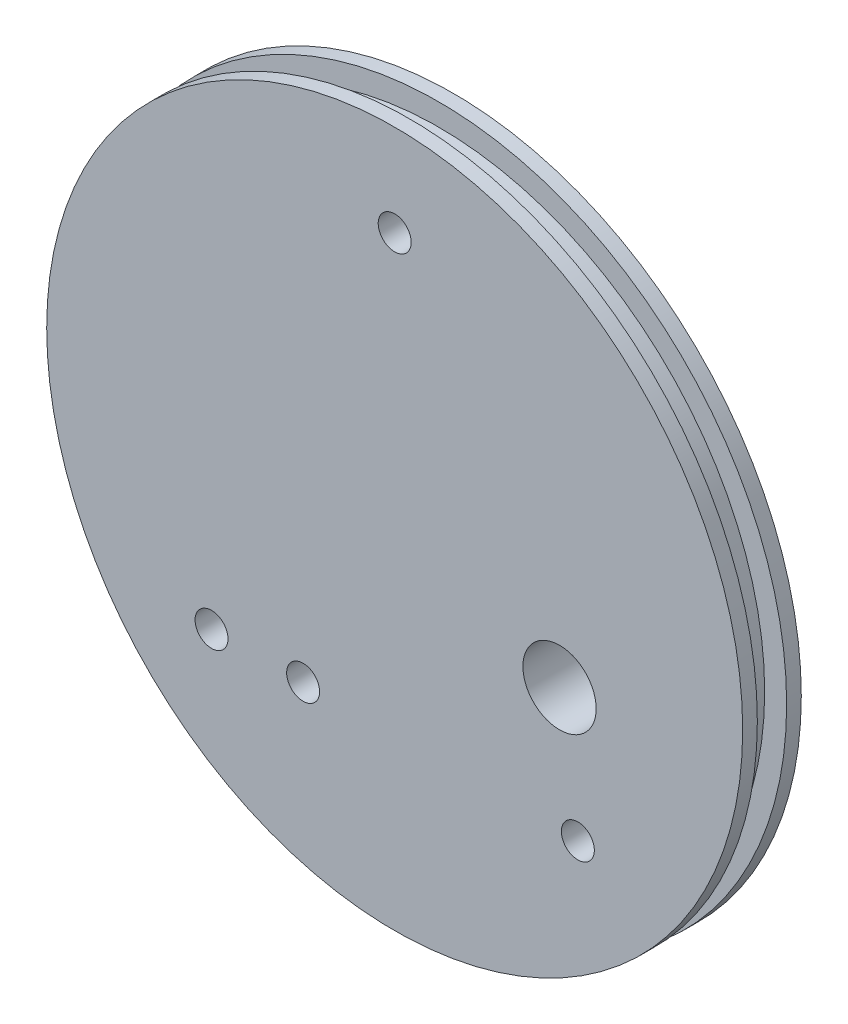
ISO-10303-21;
HEADER;
FILE_DESCRIPTION(('STEP AP214'),'2;1');
FILE_NAME('part.step','',(''),(''),'','','');
FILE_SCHEMA(('AUTOMOTIVE_DESIGN { 1 0 10303 214 1 1 1 1 }'));
ENDSEC;
DATA;
#1=APPLICATION_CONTEXT('core data for automotive mechanical design processes');
#2=APPLICATION_PROTOCOL_DEFINITION('international standard','automotive_design',2000,#1);
#3=PRODUCT_CONTEXT('',#1,'mechanical');
#4=PRODUCT('Part','Part','',(#3));
#5=PRODUCT_RELATED_PRODUCT_CATEGORY('part','',(#4));
#6=PRODUCT_DEFINITION_FORMATION('','',#4);
#7=PRODUCT_DEFINITION_CONTEXT('part definition',#1,'design');
#8=PRODUCT_DEFINITION('design','',#6,#7);
#9=PRODUCT_DEFINITION_SHAPE('','',#8);
#10=(LENGTH_UNIT() NAMED_UNIT(*) SI_UNIT(.MILLI.,.METRE.));
#11=(NAMED_UNIT(*) PLANE_ANGLE_UNIT() SI_UNIT($,.RADIAN.));
#12=(NAMED_UNIT(*) SI_UNIT($,.STERADIAN.) SOLID_ANGLE_UNIT());
#13=UNCERTAINTY_MEASURE_WITH_UNIT(LENGTH_MEASURE(1.E-05),#10,'distance_accuracy_value','');
#14=(GEOMETRIC_REPRESENTATION_CONTEXT(3) GLOBAL_UNCERTAINTY_ASSIGNED_CONTEXT((#13)) GLOBAL_UNIT_ASSIGNED_CONTEXT((#10,
#11,#12)) REPRESENTATION_CONTEXT('',''));
#15=CARTESIAN_POINT('',(0.,0.,0.));
#16=DIRECTION('',(0.,0.,1.));
#17=DIRECTION('',(1.,0.,0.));
#18=AXIS2_PLACEMENT_3D('',#15,#16,#17);
#19=CARTESIAN_POINT('',(0.,0.,8.));
#20=DIRECTION('',(0.,0.,1.));
#21=DIRECTION('',(1.,0.,0.));
#22=AXIS2_PLACEMENT_3D('',#19,#20,#21);
#23=PLANE('',#22);
#24=CARTESIAN_POINT('',(45.,-15.,8.));
#25=DIRECTION('',(0.,0.,1.));
#26=DIRECTION('',(1.,0.,0.));
#27=AXIS2_PLACEMENT_3D('',#24,#25,#26);
#28=CIRCLE('',#27,10.);
#29=CARTESIAN_POINT('',(55.,-15.,8.));
#30=VERTEX_POINT('',#29);
#31=EDGE_CURVE('E175',#30,#30,#28,.T.);
#32=ORIENTED_EDGE('',*,*,#31,.F.);
#33=EDGE_LOOP('',(#32));
#34=FACE_BOUND('',#33,.T.);
#35=CARTESIAN_POINT('',(0.,70.,8.00000000000001));
#36=DIRECTION('',(0.,0.,1.));
#37=DIRECTION('',(1.,0.,0.));
#38=AXIS2_PLACEMENT_3D('',#35,#36,#37);
#39=CIRCLE('',#38,4.5);
#40=CARTESIAN_POINT('',(4.5,70.,8.00000000000001));
#41=VERTEX_POINT('',#40);
#42=EDGE_CURVE('E181',#41,#41,#39,.F.);
#43=ORIENTED_EDGE('',*,*,#42,.T.);
#44=EDGE_LOOP('',(#43));
#45=FACE_BOUND('',#44,.T.);
#46=CARTESIAN_POINT('',(-50.,-48.75,8.));
#47=DIRECTION('',(0.,0.,1.));
#48=DIRECTION('',(1.,0.,0.));
#49=AXIS2_PLACEMENT_3D('',#46,#47,#48);
#50=CIRCLE('',#49,4.5);
#51=CARTESIAN_POINT('',(-45.5,-48.75,8.00000000000001));
#52=VERTEX_POINT('',#51);
#53=EDGE_CURVE('E75',#52,#52,#50,.T.);
#54=ORIENTED_EDGE('',*,*,#53,.F.);
#55=EDGE_LOOP('',(#54));
#56=FACE_BOUND('',#55,.T.);
#57=CARTESIAN_POINT('',(50.,-48.75,8.));
#58=DIRECTION('',(0.,0.,1.));
#59=DIRECTION('',(1.,0.,0.));
#60=AXIS2_PLACEMENT_3D('',#57,#58,#59);
#61=CIRCLE('',#60,4.5);
#62=CARTESIAN_POINT('',(54.5,-48.75,8.00000000000001));
#63=VERTEX_POINT('',#62);
#64=EDGE_CURVE('E187',#63,#63,#61,.T.);
#65=ORIENTED_EDGE('',*,*,#64,.F.);
#66=EDGE_LOOP('',(#65));
#67=FACE_BOUND('',#66,.T.);
#68=CARTESIAN_POINT('',(-25.,-48.75,8.));
#69=DIRECTION('',(0.,0.,1.));
#70=DIRECTION('',(1.,0.,0.));
#71=AXIS2_PLACEMENT_3D('',#68,#69,#70);
#72=CIRCLE('',#71,4.50000000000001);
#73=CARTESIAN_POINT('',(-20.5,-48.75,8.00000000000001));
#74=VERTEX_POINT('',#73);
#75=EDGE_CURVE('E95',#74,#74,#72,.T.);
#76=ORIENTED_EDGE('',*,*,#75,.F.);
#77=EDGE_LOOP('',(#76));
#78=FACE_BOUND('',#77,.T.);
#79=CARTESIAN_POINT('',(0.,0.,8.));
#80=DIRECTION('',(0.,0.,1.));
#81=DIRECTION('',(1.,0.,0.));
#82=AXIS2_PLACEMENT_3D('',#79,#80,#81);
#83=CIRCLE('',#82,95.);
#84=CARTESIAN_POINT('',(95.,0.,8.));
#85=VERTEX_POINT('',#84);
#86=EDGE_CURVE('E60',#85,#85,#83,.T.);
#87=ORIENTED_EDGE('',*,*,#86,.T.);
#88=EDGE_LOOP('',(#87));
#89=FACE_BOUND('',#88,.T.);
#90=ADVANCED_FACE('F51',(#34,#45,#56,#67,#78,#89),#23,.T.);
#91=CARTESIAN_POINT('',(0.,0.,-8.));
#92=DIRECTION('',(0.,0.,1.));
#93=DIRECTION('',(1.,0.,0.));
#94=AXIS2_PLACEMENT_3D('',#91,#92,#93);
#95=CYLINDRICAL_SURFACE('',#94,95.);
#96=CARTESIAN_POINT('',(0.,0.,4.));
#97=DIRECTION('',(0.,0.,1.));
#98=DIRECTION('',(1.,0.,0.));
#99=AXIS2_PLACEMENT_3D('',#96,#97,#98);
#100=CIRCLE('',#99,95.);
#101=CARTESIAN_POINT('',(95.,0.,4.));
#102=VERTEX_POINT('',#101);
#103=EDGE_CURVE('E66',#102,#102,#100,.T.);
#104=ORIENTED_EDGE('',*,*,#103,.T.);
#105=EDGE_LOOP('',(#104));
#106=FACE_BOUND('',#105,.T.);
#107=ORIENTED_EDGE('',*,*,#86,.F.);
#108=EDGE_LOOP('',(#107));
#109=FACE_BOUND('',#108,.T.);
#110=ADVANCED_FACE('F53',(#106,#109),#95,.T.);
#111=CARTESIAN_POINT('',(0.,0.,4.));
#112=DIRECTION('',(0.,0.,1.));
#113=DIRECTION('',(1.,0.,0.));
#114=AXIS2_PLACEMENT_3D('',#111,#112,#113);
#115=PLANE('',#114);
#116=ORIENTED_EDGE('',*,*,#103,.F.);
#117=EDGE_LOOP('',(#116));
#118=FACE_BOUND('',#117,.T.);
#119=CARTESIAN_POINT('',(0.,0.,4.));
#120=DIRECTION('',(0.,0.,1.));
#121=DIRECTION('',(1.,0.,0.));
#122=AXIS2_PLACEMENT_3D('',#119,#120,#121);
#123=CIRCLE('',#122,89.);
#124=CARTESIAN_POINT('',(89.,0.,4.));
#125=VERTEX_POINT('',#124);
#126=EDGE_CURVE('E92',#125,#125,#123,.T.);
#127=ORIENTED_EDGE('',*,*,#126,.T.);
#128=EDGE_LOOP('',(#127));
#129=FACE_BOUND('',#128,.T.);
#130=ADVANCED_FACE('F106',(#118,#129),#115,.F.);
#131=CARTESIAN_POINT('',(0.,0.,4.));
#132=DIRECTION('',(0.,0.,-1.));
#133=DIRECTION('',(-1.,0.,0.));
#134=AXIS2_PLACEMENT_3D('',#131,#132,#133);
#135=CYLINDRICAL_SURFACE('',#134,89.);
#136=ORIENTED_EDGE('',*,*,#126,.F.);
#137=EDGE_LOOP('',(#136));
#138=FACE_BOUND('',#137,.T.);
#139=CARTESIAN_POINT('',(0.,0.,-4.));
#140=DIRECTION('',(0.,0.,1.));
#141=DIRECTION('',(1.,0.,0.));
#142=AXIS2_PLACEMENT_3D('',#139,#140,#141);
#143=CIRCLE('',#142,89.);
#144=CARTESIAN_POINT('',(89.,0.,-4.));
#145=VERTEX_POINT('',#144);
#146=EDGE_CURVE('E81',#145,#145,#143,.T.);
#147=ORIENTED_EDGE('',*,*,#146,.T.);
#148=EDGE_LOOP('',(#147));
#149=FACE_BOUND('',#148,.T.);
#150=ADVANCED_FACE('F109',(#138,#149),#135,.T.);
#151=CARTESIAN_POINT('',(0.,0.,-4.));
#152=DIRECTION('',(0.,0.,1.));
#153=DIRECTION('',(1.,0.,0.));
#154=AXIS2_PLACEMENT_3D('',#151,#152,#153);
#155=PLANE('',#154);
#156=ORIENTED_EDGE('',*,*,#146,.F.);
#157=EDGE_LOOP('',(#156));
#158=FACE_BOUND('',#157,.T.);
#159=CARTESIAN_POINT('',(0.,0.,-4.));
#160=DIRECTION('',(0.,0.,1.));
#161=DIRECTION('',(1.,0.,0.));
#162=AXIS2_PLACEMENT_3D('',#159,#160,#161);
#163=CIRCLE('',#162,95.);
#164=CARTESIAN_POINT('',(95.,0.,-4.));
#165=VERTEX_POINT('',#164);
#166=EDGE_CURVE('E86',#165,#165,#163,.T.);
#167=ORIENTED_EDGE('',*,*,#166,.T.);
#168=EDGE_LOOP('',(#167));
#169=FACE_BOUND('',#168,.T.);
#170=ADVANCED_FACE('F114',(#158,#169),#155,.T.);
#171=CARTESIAN_POINT('',(0.,0.,-8.));
#172=DIRECTION('',(0.,0.,1.));
#173=DIRECTION('',(1.,0.,0.));
#174=AXIS2_PLACEMENT_3D('',#171,#172,#173);
#175=PLANE('',#174);
#176=CARTESIAN_POINT('',(45.,-15.,-8.));
#177=DIRECTION('',(0.,0.,-1.));
#178=DIRECTION('',(-1.,0.,0.));
#179=AXIS2_PLACEMENT_3D('',#176,#177,#178);
#180=CIRCLE('',#179,10.);
#181=CARTESIAN_POINT('',(35.,-15.,-8.));
#182=VERTEX_POINT('',#181);
#183=EDGE_CURVE('E140',#182,#182,#180,.T.);
#184=ORIENTED_EDGE('',*,*,#183,.F.);
#185=EDGE_LOOP('',(#184));
#186=FACE_BOUND('',#185,.T.);
#187=CARTESIAN_POINT('',(0.,70.,-8.00000000000001));
#188=DIRECTION('',(0.,0.,1.));
#189=DIRECTION('',(1.,0.,0.));
#190=AXIS2_PLACEMENT_3D('',#187,#188,#189);
#191=CIRCLE('',#190,4.5);
#192=CARTESIAN_POINT('',(4.5,70.,-8.00000000000001));
#193=VERTEX_POINT('',#192);
#194=EDGE_CURVE('E55',#193,#193,#191,.F.);
#195=ORIENTED_EDGE('',*,*,#194,.F.);
#196=EDGE_LOOP('',(#195));
#197=FACE_BOUND('',#196,.T.);
#198=CARTESIAN_POINT('',(-50.,-48.75,-8.00000000000001));
#199=DIRECTION('',(0.,0.,1.));
#200=DIRECTION('',(1.,0.,0.));
#201=AXIS2_PLACEMENT_3D('',#198,#199,#200);
#202=CIRCLE('',#201,4.5);
#203=CARTESIAN_POINT('',(-45.5,-48.75,-8.00000000000001));
#204=VERTEX_POINT('',#203);
#205=EDGE_CURVE('E78',#204,#204,#202,.T.);
#206=ORIENTED_EDGE('',*,*,#205,.T.);
#207=EDGE_LOOP('',(#206));
#208=FACE_BOUND('',#207,.T.);
#209=CARTESIAN_POINT('',(50.,-48.75,-8.00000000000001));
#210=DIRECTION('',(0.,0.,1.));
#211=DIRECTION('',(1.,0.,0.));
#212=AXIS2_PLACEMENT_3D('',#209,#210,#211);
#213=CIRCLE('',#212,4.5);
#214=CARTESIAN_POINT('',(54.5,-48.75,-8.00000000000001));
#215=VERTEX_POINT('',#214);
#216=EDGE_CURVE('E74',#215,#215,#213,.T.);
#217=ORIENTED_EDGE('',*,*,#216,.T.);
#218=EDGE_LOOP('',(#217));
#219=FACE_BOUND('',#218,.T.);
#220=CARTESIAN_POINT('',(-25.,-48.75,-8.00000000000001));
#221=DIRECTION('',(0.,0.,1.));
#222=DIRECTION('',(1.,0.,0.));
#223=AXIS2_PLACEMENT_3D('',#220,#221,#222);
#224=CIRCLE('',#223,4.50000000000001);
#225=CARTESIAN_POINT('',(-20.5,-48.75,-8.00000000000001));
#226=VERTEX_POINT('',#225);
#227=EDGE_CURVE('E70',#226,#226,#224,.T.);
#228=ORIENTED_EDGE('',*,*,#227,.T.);
#229=EDGE_LOOP('',(#228));
#230=FACE_BOUND('',#229,.T.);
#231=CARTESIAN_POINT('',(0.,0.,-8.));
#232=DIRECTION('',(0.,0.,1.));
#233=DIRECTION('',(1.,0.,0.));
#234=AXIS2_PLACEMENT_3D('',#231,#232,#233);
#235=CIRCLE('',#234,95.);
#236=CARTESIAN_POINT('',(95.,0.,-8.));
#237=VERTEX_POINT('',#236);
#238=EDGE_CURVE('E11',#237,#237,#235,.T.);
#239=ORIENTED_EDGE('',*,*,#238,.F.);
#240=EDGE_LOOP('',(#239));
#241=FACE_BOUND('',#240,.T.);
#242=ADVANCED_FACE('F119',(#186,#197,#208,#219,#230,#241),#175,.F.);
#243=ORIENTED_EDGE('',*,*,#238,.T.);
#244=EDGE_LOOP('',(#243));
#245=FACE_BOUND('',#244,.T.);
#246=ORIENTED_EDGE('',*,*,#166,.F.);
#247=EDGE_LOOP('',(#246));
#248=FACE_BOUND('',#247,.T.);
#249=ADVANCED_FACE('F128',(#245,#248),#95,.T.);
#250=CARTESIAN_POINT('',(-25.,-48.75,-159.));
#251=DIRECTION('',(0.,0.,1.));
#252=DIRECTION('',(1.,0.,0.));
#253=AXIS2_PLACEMENT_3D('',#250,#251,#252);
#254=CYLINDRICAL_SURFACE('',#253,4.50000000000001);
#255=CARTESIAN_POINT('',(-20.5,-48.75,8.00000000000001));
#256=CARTESIAN_POINT('',(-20.5,-48.75,7.83333333333334));
#257=CARTESIAN_POINT('',(-20.5,-48.75,7.66666666666667));
#258=CARTESIAN_POINT('',(-20.5,-48.75,7.33333333333334));
#259=CARTESIAN_POINT('',(-20.5,-48.75,7.16666666666667));
#260=CARTESIAN_POINT('',(-20.5,-48.75,6.83333333333334));
#261=CARTESIAN_POINT('',(-20.5,-48.75,6.66666666666667));
#262=CARTESIAN_POINT('',(-20.5,-48.75,6.33333333333334));
#263=CARTESIAN_POINT('',(-20.5,-48.75,6.16666666666667));
#264=CARTESIAN_POINT('',(-20.5,-48.75,5.83333333333334));
#265=CARTESIAN_POINT('',(-20.5,-48.75,5.66666666666667));
#266=CARTESIAN_POINT('',(-20.5,-48.75,5.33333333333334));
#267=CARTESIAN_POINT('',(-20.5,-48.75,5.16666666666667));
#268=CARTESIAN_POINT('',(-20.5,-48.75,4.83333333333334));
#269=CARTESIAN_POINT('',(-20.5,-48.75,4.66666666666667));
#270=CARTESIAN_POINT('',(-20.5,-48.75,4.33333333333334));
#271=CARTESIAN_POINT('',(-20.5,-48.75,4.16666666666667));
#272=CARTESIAN_POINT('',(-20.5,-48.75,3.83333333333334));
#273=CARTESIAN_POINT('',(-20.5,-48.75,3.66666666666667));
#274=CARTESIAN_POINT('',(-20.5,-48.75,3.33333333333334));
#275=CARTESIAN_POINT('',(-20.5,-48.75,3.16666666666667));
#276=CARTESIAN_POINT('',(-20.5,-48.75,2.83333333333334));
#277=CARTESIAN_POINT('',(-20.5,-48.75,2.66666666666667));
#278=CARTESIAN_POINT('',(-20.5,-48.75,2.33333333333334));
#279=CARTESIAN_POINT('',(-20.5,-48.75,2.16666666666667));
#280=CARTESIAN_POINT('',(-20.5,-48.75,1.83333333333334));
#281=CARTESIAN_POINT('',(-20.5,-48.75,1.66666666666667));
#282=CARTESIAN_POINT('',(-20.5,-48.75,1.33333333333333));
#283=CARTESIAN_POINT('',(-20.5,-48.75,1.16666666666667));
#284=CARTESIAN_POINT('',(-20.5,-48.75,0.833333333333334));
#285=CARTESIAN_POINT('',(-20.5,-48.75,0.666666666666667));
#286=CARTESIAN_POINT('',(-20.5,-48.75,0.333333333333334));
#287=CARTESIAN_POINT('',(-20.5,-48.75,0.166666666666667));
#288=CARTESIAN_POINT('',(-20.5,-48.75,-0.166666666666667));
#289=CARTESIAN_POINT('',(-20.5,-48.75,-0.333333333333334));
#290=CARTESIAN_POINT('',(-20.5,-48.75,-0.666666666666667));
#291=CARTESIAN_POINT('',(-20.5,-48.75,-0.833333333333334));
#292=CARTESIAN_POINT('',(-20.5,-48.75,-1.16666666666667));
#293=CARTESIAN_POINT('',(-20.5,-48.75,-1.33333333333333));
#294=CARTESIAN_POINT('',(-20.5,-48.75,-1.66666666666667));
#295=CARTESIAN_POINT('',(-20.5,-48.75,-1.83333333333334));
#296=CARTESIAN_POINT('',(-20.5,-48.75,-2.16666666666667));
#297=CARTESIAN_POINT('',(-20.5,-48.75,-2.33333333333334));
#298=CARTESIAN_POINT('',(-20.5,-48.75,-2.66666666666667));
#299=CARTESIAN_POINT('',(-20.5,-48.75,-2.83333333333334));
#300=CARTESIAN_POINT('',(-20.5,-48.75,-3.16666666666667));
#301=CARTESIAN_POINT('',(-20.5,-48.75,-3.33333333333334));
#302=CARTESIAN_POINT('',(-20.5,-48.75,-3.66666666666667));
#303=CARTESIAN_POINT('',(-20.5,-48.75,-3.83333333333334));
#304=CARTESIAN_POINT('',(-20.5,-48.75,-4.16666666666667));
#305=CARTESIAN_POINT('',(-20.5,-48.75,-4.33333333333334));
#306=CARTESIAN_POINT('',(-20.5,-48.75,-4.66666666666667));
#307=CARTESIAN_POINT('',(-20.5,-48.75,-4.83333333333334));
#308=CARTESIAN_POINT('',(-20.5,-48.75,-5.16666666666667));
#309=CARTESIAN_POINT('',(-20.5,-48.75,-5.33333333333334));
#310=CARTESIAN_POINT('',(-20.5,-48.75,-5.66666666666667));
#311=CARTESIAN_POINT('',(-20.5,-48.75,-5.83333333333334));
#312=CARTESIAN_POINT('',(-20.5,-48.75,-6.16666666666667));
#313=CARTESIAN_POINT('',(-20.5,-48.75,-6.33333333333334));
#314=CARTESIAN_POINT('',(-20.5,-48.75,-6.66666666666667));
#315=CARTESIAN_POINT('',(-20.5,-48.75,-6.83333333333334));
#316=CARTESIAN_POINT('',(-20.5,-48.75,-7.16666666666667));
#317=CARTESIAN_POINT('',(-20.5,-48.75,-7.33333333333334));
#318=CARTESIAN_POINT('',(-20.5,-48.75,-7.66666666666667));
#319=CARTESIAN_POINT('',(-20.5,-48.75,-7.83333333333334));
#320=CARTESIAN_POINT('',(-20.5,-48.75,-8.00000000000001));
#321=B_SPLINE_CURVE_WITH_KNOTS('',3,(#255,#256,#257,#258,#259,#260,#261,#262,#263,#264,#265,
#266,#267,#268,#269,#270,#271,#272,#273,#274,#275,#276,#277,#278,#279,#280,#281,#282,#283,#284,
#285,#286,#287,#288,#289,#290,#291,#292,#293,#294,#295,#296,#297,#298,#299,#300,#301,#302,#303,
#304,#305,#306,#307,#308,#309,#310,#311,#312,#313,#314,#315,#316,#317,#318,#319,#320),
.UNSPECIFIED.,.F.,.F.,(4,2,2,2,2,2,2,2,2,2,2,2,2,2,2,2,2,2,2,2,2,2,2,2,2,2,2,2,2,2,2,2,4),(0.,
0.5,1.,1.5,2.,2.5,3.,3.5,4.,4.5,5.,5.50000000000001,6.00000000000001,6.50000000000001,
7.00000000000001,7.50000000000001,8.00000000000001,8.50000000000001,9.00000000000001,
9.50000000000001,10.,10.5,11.,11.5,12.,12.5,13.,13.5,14.,14.5,15.,15.5,16.),.UNSPECIFIED.);
#322=EDGE_CURVE('BSEAM136',#74,#226,#321,.T.);
#323=ORIENTED_EDGE('',*,*,#75,.T.);
#324=ORIENTED_EDGE('',*,*,#227,.F.);
#325=ORIENTED_EDGE('',*,*,#322,.T.);
#326=ORIENTED_EDGE('',*,*,#322,.F.);
#327=EDGE_LOOP('',(#323,#325,#324,#326));
#328=FACE_BOUND('',#327,.T.);
#329=ADVANCED_FACE('F136',(#328),#254,.F.);
#330=CARTESIAN_POINT('',(50.,-48.75,-159.));
#331=DIRECTION('',(0.,0.,1.));
#332=DIRECTION('',(1.,0.,0.));
#333=AXIS2_PLACEMENT_3D('',#330,#331,#332);
#334=CYLINDRICAL_SURFACE('',#333,4.5);
#335=CARTESIAN_POINT('',(54.5,-48.75,8.00000000000001));
#336=CARTESIAN_POINT('',(54.5,-48.75,7.83333333333334));
#337=CARTESIAN_POINT('',(54.5,-48.75,7.66666666666667));
#338=CARTESIAN_POINT('',(54.5,-48.75,7.33333333333334));
#339=CARTESIAN_POINT('',(54.5,-48.75,7.16666666666667));
#340=CARTESIAN_POINT('',(54.5,-48.75,6.83333333333334));
#341=CARTESIAN_POINT('',(54.5,-48.75,6.66666666666667));
#342=CARTESIAN_POINT('',(54.5,-48.75,6.33333333333334));
#343=CARTESIAN_POINT('',(54.5,-48.75,6.16666666666667));
#344=CARTESIAN_POINT('',(54.5,-48.75,5.83333333333334));
#345=CARTESIAN_POINT('',(54.5,-48.75,5.66666666666667));
#346=CARTESIAN_POINT('',(54.5,-48.75,5.33333333333334));
#347=CARTESIAN_POINT('',(54.5,-48.75,5.16666666666667));
#348=CARTESIAN_POINT('',(54.5,-48.75,4.83333333333334));
#349=CARTESIAN_POINT('',(54.5,-48.75,4.66666666666667));
#350=CARTESIAN_POINT('',(54.5,-48.75,4.33333333333334));
#351=CARTESIAN_POINT('',(54.5,-48.75,4.16666666666667));
#352=CARTESIAN_POINT('',(54.5,-48.75,3.83333333333334));
#353=CARTESIAN_POINT('',(54.5,-48.75,3.66666666666667));
#354=CARTESIAN_POINT('',(54.5,-48.75,3.33333333333334));
#355=CARTESIAN_POINT('',(54.5,-48.75,3.16666666666667));
#356=CARTESIAN_POINT('',(54.5,-48.75,2.83333333333334));
#357=CARTESIAN_POINT('',(54.5,-48.75,2.66666666666667));
#358=CARTESIAN_POINT('',(54.5,-48.75,2.33333333333334));
#359=CARTESIAN_POINT('',(54.5,-48.75,2.16666666666667));
#360=CARTESIAN_POINT('',(54.5,-48.75,1.83333333333334));
#361=CARTESIAN_POINT('',(54.5,-48.75,1.66666666666667));
#362=CARTESIAN_POINT('',(54.5,-48.75,1.33333333333333));
#363=CARTESIAN_POINT('',(54.5,-48.75,1.16666666666667));
#364=CARTESIAN_POINT('',(54.5,-48.75,0.833333333333334));
#365=CARTESIAN_POINT('',(54.5,-48.75,0.666666666666667));
#366=CARTESIAN_POINT('',(54.5,-48.75,0.333333333333334));
#367=CARTESIAN_POINT('',(54.5,-48.75,0.166666666666667));
#368=CARTESIAN_POINT('',(54.5,-48.75,-0.166666666666667));
#369=CARTESIAN_POINT('',(54.5,-48.75,-0.333333333333334));
#370=CARTESIAN_POINT('',(54.5,-48.75,-0.666666666666667));
#371=CARTESIAN_POINT('',(54.5,-48.75,-0.833333333333334));
#372=CARTESIAN_POINT('',(54.5,-48.75,-1.16666666666667));
#373=CARTESIAN_POINT('',(54.5,-48.75,-1.33333333333333));
#374=CARTESIAN_POINT('',(54.5,-48.75,-1.66666666666667));
#375=CARTESIAN_POINT('',(54.5,-48.75,-1.83333333333334));
#376=CARTESIAN_POINT('',(54.5,-48.75,-2.16666666666667));
#377=CARTESIAN_POINT('',(54.5,-48.75,-2.33333333333334));
#378=CARTESIAN_POINT('',(54.5,-48.75,-2.66666666666667));
#379=CARTESIAN_POINT('',(54.5,-48.75,-2.83333333333334));
#380=CARTESIAN_POINT('',(54.5,-48.75,-3.16666666666667));
#381=CARTESIAN_POINT('',(54.5,-48.75,-3.33333333333334));
#382=CARTESIAN_POINT('',(54.5,-48.75,-3.66666666666667));
#383=CARTESIAN_POINT('',(54.5,-48.75,-3.83333333333334));
#384=CARTESIAN_POINT('',(54.5,-48.75,-4.16666666666667));
#385=CARTESIAN_POINT('',(54.5,-48.75,-4.33333333333334));
#386=CARTESIAN_POINT('',(54.5,-48.75,-4.66666666666667));
#387=CARTESIAN_POINT('',(54.5,-48.75,-4.83333333333334));
#388=CARTESIAN_POINT('',(54.5,-48.75,-5.16666666666667));
#389=CARTESIAN_POINT('',(54.5,-48.75,-5.33333333333334));
#390=CARTESIAN_POINT('',(54.5,-48.75,-5.66666666666667));
#391=CARTESIAN_POINT('',(54.5,-48.75,-5.83333333333334));
#392=CARTESIAN_POINT('',(54.5,-48.75,-6.16666666666667));
#393=CARTESIAN_POINT('',(54.5,-48.75,-6.33333333333334));
#394=CARTESIAN_POINT('',(54.5,-48.75,-6.66666666666667));
#395=CARTESIAN_POINT('',(54.5,-48.75,-6.83333333333334));
#396=CARTESIAN_POINT('',(54.5,-48.75,-7.16666666666667));
#397=CARTESIAN_POINT('',(54.5,-48.75,-7.33333333333334));
#398=CARTESIAN_POINT('',(54.5,-48.75,-7.66666666666667));
#399=CARTESIAN_POINT('',(54.5,-48.75,-7.83333333333334));
#400=CARTESIAN_POINT('',(54.5,-48.75,-8.00000000000001));
#401=B_SPLINE_CURVE_WITH_KNOTS('',3,(#335,#336,#337,#338,#339,#340,#341,#342,#343,#344,#345,
#346,#347,#348,#349,#350,#351,#352,#353,#354,#355,#356,#357,#358,#359,#360,#361,#362,#363,#364,
#365,#366,#367,#368,#369,#370,#371,#372,#373,#374,#375,#376,#377,#378,#379,#380,#381,#382,#383,
#384,#385,#386,#387,#388,#389,#390,#391,#392,#393,#394,#395,#396,#397,#398,#399,#400),
.UNSPECIFIED.,.F.,.F.,(4,2,2,2,2,2,2,2,2,2,2,2,2,2,2,2,2,2,2,2,2,2,2,2,2,2,2,2,2,2,2,2,4),(0.,
0.5,1.,1.5,2.,2.5,3.,3.5,4.,4.5,5.,5.50000000000001,6.00000000000001,6.50000000000001,
7.00000000000001,7.50000000000001,8.00000000000001,8.50000000000001,9.00000000000001,
9.50000000000001,10.,10.5,11.,11.5,12.,12.5,13.,13.5,14.,14.5,15.,15.5,16.),.UNSPECIFIED.);
#402=EDGE_CURVE('BSEAM150',#63,#215,#401,.T.);
#403=ORIENTED_EDGE('',*,*,#64,.T.);
#404=ORIENTED_EDGE('',*,*,#216,.F.);
#405=ORIENTED_EDGE('',*,*,#402,.T.);
#406=ORIENTED_EDGE('',*,*,#402,.F.);
#407=EDGE_LOOP('',(#403,#405,#404,#406));
#408=FACE_BOUND('',#407,.T.);
#409=ADVANCED_FACE('F150',(#408),#334,.F.);
#410=CARTESIAN_POINT('',(-50.,-48.75,-159.));
#411=DIRECTION('',(0.,0.,1.));
#412=DIRECTION('',(1.,0.,0.));
#413=AXIS2_PLACEMENT_3D('',#410,#411,#412);
#414=CYLINDRICAL_SURFACE('',#413,4.5);
#415=CARTESIAN_POINT('',(-45.5,-48.75,8.00000000000001));
#416=CARTESIAN_POINT('',(-45.5,-48.75,7.83333333333334));
#417=CARTESIAN_POINT('',(-45.5,-48.75,7.66666666666667));
#418=CARTESIAN_POINT('',(-45.5,-48.75,7.33333333333334));
#419=CARTESIAN_POINT('',(-45.5,-48.75,7.16666666666667));
#420=CARTESIAN_POINT('',(-45.5,-48.75,6.83333333333334));
#421=CARTESIAN_POINT('',(-45.5,-48.75,6.66666666666667));
#422=CARTESIAN_POINT('',(-45.5,-48.75,6.33333333333334));
#423=CARTESIAN_POINT('',(-45.5,-48.75,6.16666666666667));
#424=CARTESIAN_POINT('',(-45.5,-48.75,5.83333333333334));
#425=CARTESIAN_POINT('',(-45.5,-48.75,5.66666666666667));
#426=CARTESIAN_POINT('',(-45.5,-48.75,5.33333333333334));
#427=CARTESIAN_POINT('',(-45.5,-48.75,5.16666666666667));
#428=CARTESIAN_POINT('',(-45.5,-48.75,4.83333333333334));
#429=CARTESIAN_POINT('',(-45.5,-48.75,4.66666666666667));
#430=CARTESIAN_POINT('',(-45.5,-48.75,4.33333333333334));
#431=CARTESIAN_POINT('',(-45.5,-48.75,4.16666666666667));
#432=CARTESIAN_POINT('',(-45.5,-48.75,3.83333333333334));
#433=CARTESIAN_POINT('',(-45.5,-48.75,3.66666666666667));
#434=CARTESIAN_POINT('',(-45.5,-48.75,3.33333333333334));
#435=CARTESIAN_POINT('',(-45.5,-48.75,3.16666666666667));
#436=CARTESIAN_POINT('',(-45.5,-48.75,2.83333333333334));
#437=CARTESIAN_POINT('',(-45.5,-48.75,2.66666666666667));
#438=CARTESIAN_POINT('',(-45.5,-48.75,2.33333333333334));
#439=CARTESIAN_POINT('',(-45.5,-48.75,2.16666666666667));
#440=CARTESIAN_POINT('',(-45.5,-48.75,1.83333333333334));
#441=CARTESIAN_POINT('',(-45.5,-48.75,1.66666666666667));
#442=CARTESIAN_POINT('',(-45.5,-48.75,1.33333333333333));
#443=CARTESIAN_POINT('',(-45.5,-48.75,1.16666666666667));
#444=CARTESIAN_POINT('',(-45.5,-48.75,0.833333333333334));
#445=CARTESIAN_POINT('',(-45.5,-48.75,0.666666666666667));
#446=CARTESIAN_POINT('',(-45.5,-48.75,0.333333333333334));
#447=CARTESIAN_POINT('',(-45.5,-48.75,0.166666666666667));
#448=CARTESIAN_POINT('',(-45.5,-48.75,-0.166666666666667));
#449=CARTESIAN_POINT('',(-45.5,-48.75,-0.333333333333334));
#450=CARTESIAN_POINT('',(-45.5,-48.75,-0.666666666666667));
#451=CARTESIAN_POINT('',(-45.5,-48.75,-0.833333333333334));
#452=CARTESIAN_POINT('',(-45.5,-48.75,-1.16666666666667));
#453=CARTESIAN_POINT('',(-45.5,-48.75,-1.33333333333333));
#454=CARTESIAN_POINT('',(-45.5,-48.75,-1.66666666666667));
#455=CARTESIAN_POINT('',(-45.5,-48.75,-1.83333333333334));
#456=CARTESIAN_POINT('',(-45.5,-48.75,-2.16666666666667));
#457=CARTESIAN_POINT('',(-45.5,-48.75,-2.33333333333334));
#458=CARTESIAN_POINT('',(-45.5,-48.75,-2.66666666666667));
#459=CARTESIAN_POINT('',(-45.5,-48.75,-2.83333333333334));
#460=CARTESIAN_POINT('',(-45.5,-48.75,-3.16666666666667));
#461=CARTESIAN_POINT('',(-45.5,-48.75,-3.33333333333334));
#462=CARTESIAN_POINT('',(-45.5,-48.75,-3.66666666666667));
#463=CARTESIAN_POINT('',(-45.5,-48.75,-3.83333333333334));
#464=CARTESIAN_POINT('',(-45.5,-48.75,-4.16666666666667));
#465=CARTESIAN_POINT('',(-45.5,-48.75,-4.33333333333334));
#466=CARTESIAN_POINT('',(-45.5,-48.75,-4.66666666666667));
#467=CARTESIAN_POINT('',(-45.5,-48.75,-4.83333333333334));
#468=CARTESIAN_POINT('',(-45.5,-48.75,-5.16666666666667));
#469=CARTESIAN_POINT('',(-45.5,-48.75,-5.33333333333334));
#470=CARTESIAN_POINT('',(-45.5,-48.75,-5.66666666666667));
#471=CARTESIAN_POINT('',(-45.5,-48.75,-5.83333333333334));
#472=CARTESIAN_POINT('',(-45.5,-48.75,-6.16666666666667));
#473=CARTESIAN_POINT('',(-45.5,-48.75,-6.33333333333334));
#474=CARTESIAN_POINT('',(-45.5,-48.75,-6.66666666666667));
#475=CARTESIAN_POINT('',(-45.5,-48.75,-6.83333333333334));
#476=CARTESIAN_POINT('',(-45.5,-48.75,-7.16666666666667));
#477=CARTESIAN_POINT('',(-45.5,-48.75,-7.33333333333334));
#478=CARTESIAN_POINT('',(-45.5,-48.75,-7.66666666666667));
#479=CARTESIAN_POINT('',(-45.5,-48.75,-7.83333333333334));
#480=CARTESIAN_POINT('',(-45.5,-48.75,-8.00000000000001));
#481=B_SPLINE_CURVE_WITH_KNOTS('',3,(#415,#416,#417,#418,#419,#420,#421,#422,#423,#424,#425,
#426,#427,#428,#429,#430,#431,#432,#433,#434,#435,#436,#437,#438,#439,#440,#441,#442,#443,#444,
#445,#446,#447,#448,#449,#450,#451,#452,#453,#454,#455,#456,#457,#458,#459,#460,#461,#462,#463,
#464,#465,#466,#467,#468,#469,#470,#471,#472,#473,#474,#475,#476,#477,#478,#479,#480),
.UNSPECIFIED.,.F.,.F.,(4,2,2,2,2,2,2,2,2,2,2,2,2,2,2,2,2,2,2,2,2,2,2,2,2,2,2,2,2,2,2,2,4),(0.,
0.5,1.,1.5,2.,2.5,3.,3.5,4.,4.5,5.,5.50000000000001,6.00000000000001,6.50000000000001,
7.00000000000001,7.50000000000001,8.00000000000001,8.50000000000001,9.00000000000001,
9.50000000000001,10.,10.5,11.,11.5,12.,12.5,13.,13.5,14.,14.5,15.,15.5,16.),.UNSPECIFIED.);
#482=EDGE_CURVE('BSEAM156',#52,#204,#481,.T.);
#483=ORIENTED_EDGE('',*,*,#53,.T.);
#484=ORIENTED_EDGE('',*,*,#205,.F.);
#485=ORIENTED_EDGE('',*,*,#482,.T.);
#486=ORIENTED_EDGE('',*,*,#482,.F.);
#487=EDGE_LOOP('',(#483,#485,#484,#486));
#488=FACE_BOUND('',#487,.T.);
#489=ADVANCED_FACE('F156',(#488),#414,.F.);
#490=CARTESIAN_POINT('',(0.,70.,-120.));
#491=DIRECTION('',(0.,0.,1.));
#492=DIRECTION('',(1.,0.,0.));
#493=AXIS2_PLACEMENT_3D('',#490,#491,#492);
#494=CYLINDRICAL_SURFACE('',#493,4.5);
#495=ORIENTED_EDGE('',*,*,#42,.F.);
#496=EDGE_LOOP('',(#495));
#497=FACE_BOUND('',#496,.T.);
#498=ORIENTED_EDGE('',*,*,#194,.T.);
#499=EDGE_LOOP('',(#498));
#500=FACE_BOUND('',#499,.T.);
#501=ADVANCED_FACE('F163',(#497,#500),#494,.F.);
#502=CARTESIAN_POINT('',(45.,-15.,52.));
#503=DIRECTION('',(0.,0.,-1.));
#504=DIRECTION('',(-1.,0.,0.));
#505=AXIS2_PLACEMENT_3D('',#502,#503,#504);
#506=CYLINDRICAL_SURFACE('',#505,10.);
#507=ORIENTED_EDGE('',*,*,#31,.T.);
#508=EDGE_LOOP('',(#507));
#509=FACE_BOUND('',#508,.T.);
#510=ORIENTED_EDGE('',*,*,#183,.T.);
#511=EDGE_LOOP('',(#510));
#512=FACE_BOUND('',#511,.T.);
#513=ADVANCED_FACE('F167',(#509,#512),#506,.F.);
#514=CLOSED_SHELL('',(#90,#110,#130,#150,#170,#242,#249,#329,#409,#489,#501,#513));
#515=MANIFOLD_SOLID_BREP('B2',#514);
#516=ADVANCED_BREP_SHAPE_REPRESENTATION('',(#18,#515),#14);
#517=SHAPE_DEFINITION_REPRESENTATION(#9,#516);
ENDSEC;
END-ISO-10303-21;
